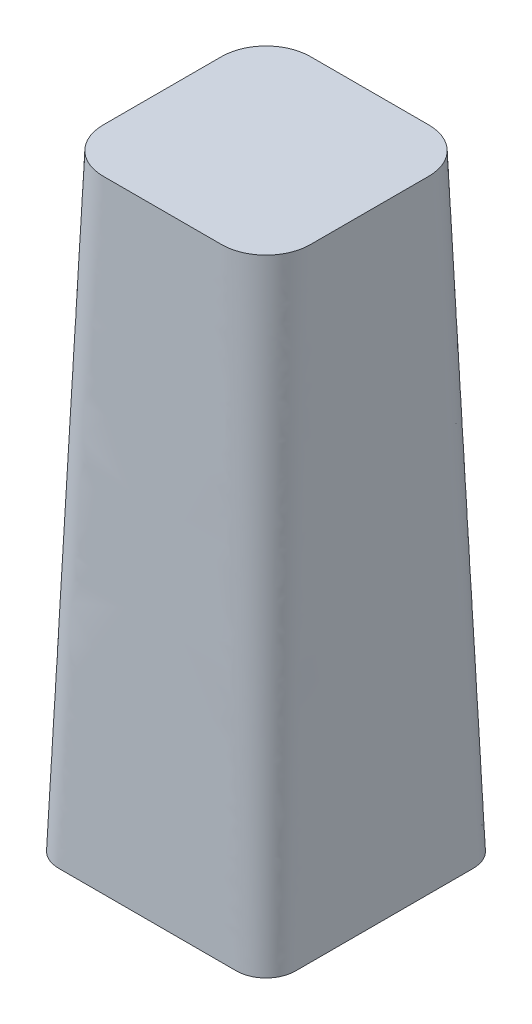
ISO-10303-21;
HEADER;
FILE_DESCRIPTION(('STEP AP214'),'2;1');
FILE_NAME('part.step','',(''),(''),'','','');
FILE_SCHEMA(('AUTOMOTIVE_DESIGN { 1 0 10303 214 1 1 1 1 }'));
ENDSEC;
DATA;
#1=APPLICATION_CONTEXT('core data for automotive mechanical design processes');
#2=APPLICATION_PROTOCOL_DEFINITION('international standard','automotive_design',2000,#1);
#3=PRODUCT_CONTEXT('',#1,'mechanical');
#4=PRODUCT('Part','Part','',(#3));
#5=PRODUCT_RELATED_PRODUCT_CATEGORY('part','',(#4));
#6=PRODUCT_DEFINITION_FORMATION('','',#4);
#7=PRODUCT_DEFINITION_CONTEXT('part definition',#1,'design');
#8=PRODUCT_DEFINITION('design','',#6,#7);
#9=PRODUCT_DEFINITION_SHAPE('','',#8);
#10=(LENGTH_UNIT() NAMED_UNIT(*) SI_UNIT(.MILLI.,.METRE.));
#11=(NAMED_UNIT(*) PLANE_ANGLE_UNIT() SI_UNIT($,.RADIAN.));
#12=(NAMED_UNIT(*) SI_UNIT($,.STERADIAN.) SOLID_ANGLE_UNIT());
#13=UNCERTAINTY_MEASURE_WITH_UNIT(LENGTH_MEASURE(1.E-05),#10,'distance_accuracy_value','');
#14=(GEOMETRIC_REPRESENTATION_CONTEXT(3) GLOBAL_UNCERTAINTY_ASSIGNED_CONTEXT((#13)) GLOBAL_UNIT_ASSIGNED_CONTEXT((#10,
#11,#12)) REPRESENTATION_CONTEXT('',''));
#15=CARTESIAN_POINT('',(0.,0.,0.));
#16=DIRECTION('',(0.,0.,1.));
#17=DIRECTION('',(1.,0.,0.));
#18=AXIS2_PLACEMENT_3D('',#15,#16,#17);
#19=CARTESIAN_POINT('',(-4.,41.,4.));
#20=DIRECTION('',(0.,1.,0.));
#21=DIRECTION('',(0.,0.,1.));
#22=AXIS2_PLACEMENT_3D('',#19,#20,#21);
#23=PLANE('',#22);
#24=CARTESIAN_POINT('',(-4.,41.,4.));
#25=DIRECTION('',(0.,1.,0.));
#26=DIRECTION('',(0.,0.,1.));
#27=AXIS2_PLACEMENT_3D('',#24,#25,#26);
#28=CIRCLE('',#27,3.);
#29=CARTESIAN_POINT('',(-7.,41.,3.99999999999998));
#30=VERTEX_POINT('',#29);
#31=CARTESIAN_POINT('',(-3.99999999991578,41.,7.));
#32=VERTEX_POINT('',#31);
#33=EDGE_CURVE('E422',#30,#32,#28,.T.);
#34=ORIENTED_EDGE('',*,*,#33,.T.);
#35=DIRECTION('',(1.,0.,0.));
#36=VECTOR('',#35,1.);
#37=CARTESIAN_POINT('',(-3.99999999999998,41.,7.));
#38=LINE('',#37,#36);
#39=CARTESIAN_POINT('',(3.99999999985876,41.,7.));
#40=VERTEX_POINT('',#39);
#41=EDGE_CURVE('E537',#32,#40,#38,.T.);
#42=ORIENTED_EDGE('',*,*,#41,.T.);
#43=CARTESIAN_POINT('',(4.,41.,4.));
#44=DIRECTION('',(0.,1.,0.));
#45=DIRECTION('',(0.,0.,1.));
#46=AXIS2_PLACEMENT_3D('',#43,#44,#45);
#47=CIRCLE('',#46,3.);
#48=CARTESIAN_POINT('',(7.,41.,3.99999999991575));
#49=VERTEX_POINT('',#48);
#50=EDGE_CURVE('E529',#40,#49,#47,.T.);
#51=ORIENTED_EDGE('',*,*,#50,.T.);
#52=DIRECTION('',(0.,0.,1.));
#53=VECTOR('',#52,1.);
#54=CARTESIAN_POINT('',(7.,41.,-3.99999999999998));
#55=LINE('',#54,#53);
#56=CARTESIAN_POINT('',(7.,41.,-3.99999999985876));
#57=VERTEX_POINT('',#56);
#58=EDGE_CURVE('E523',#57,#49,#55,.T.);
#59=ORIENTED_EDGE('',*,*,#58,.F.);
#60=CARTESIAN_POINT('',(4.,41.,-4.));
#61=DIRECTION('',(0.,1.,0.));
#62=DIRECTION('',(0.,0.,1.));
#63=AXIS2_PLACEMENT_3D('',#60,#61,#62);
#64=CIRCLE('',#63,3.);
#65=CARTESIAN_POINT('',(3.99999999991556,41.,-7.));
#66=VERTEX_POINT('',#65);
#67=EDGE_CURVE('E515',#57,#66,#64,.T.);
#68=ORIENTED_EDGE('',*,*,#67,.T.);
#69=DIRECTION('',(1.,0.,0.));
#70=VECTOR('',#69,1.);
#71=CARTESIAN_POINT('',(-3.99999999999998,41.,-7.));
#72=LINE('',#71,#70);
#73=CARTESIAN_POINT('',(-3.99999999985876,41.,-7.));
#74=VERTEX_POINT('',#73);
#75=EDGE_CURVE('E507',#74,#66,#72,.T.);
#76=ORIENTED_EDGE('',*,*,#75,.F.);
#77=CARTESIAN_POINT('',(-4.,41.,-4.));
#78=DIRECTION('',(0.,1.,0.));
#79=DIRECTION('',(0.,0.,1.));
#80=AXIS2_PLACEMENT_3D('',#77,#78,#79);
#81=CIRCLE('',#80,3.);
#82=CARTESIAN_POINT('',(-7.,41.,-3.99999999999998));
#83=VERTEX_POINT('',#82);
#84=EDGE_CURVE('E243',#74,#83,#81,.T.);
#85=ORIENTED_EDGE('',*,*,#84,.T.);
#86=DIRECTION('',(0.,0.,1.));
#87=VECTOR('',#86,1.);
#88=CARTESIAN_POINT('',(-7.,41.,-3.99999999999998));
#89=LINE('',#88,#87);
#90=EDGE_CURVE('E12',#83,#30,#89,.T.);
#91=ORIENTED_EDGE('',*,*,#90,.T.);
#92=EDGE_LOOP('',(#34,#42,#51,#59,#68,#76,#85,#91));
#93=FACE_BOUND('',#92,.T.);
#94=ADVANCED_FACE('F231',(#93),#23,.T.);
#95=CARTESIAN_POINT('',(-6.,0.,6.));
#96=DIRECTION('',(0.,1.,0.));
#97=DIRECTION('',(0.,0.,1.));
#98=AXIS2_PLACEMENT_3D('',#95,#96,#97);
#99=PLANE('',#98);
#100=CARTESIAN_POINT('',(-6.,0.,6.));
#101=DIRECTION('',(0.,1.,0.));
#102=DIRECTION('',(0.,0.,1.));
#103=AXIS2_PLACEMENT_3D('',#100,#101,#102);
#104=CIRCLE('',#103,2.);
#105=CARTESIAN_POINT('',(-8.,0.,5.99999999999999));
#106=VERTEX_POINT('',#105);
#107=CARTESIAN_POINT('',(-5.99999999999999,0.,8.));
#108=VERTEX_POINT('',#107);
#109=EDGE_CURVE('E303',#106,#108,#104,.T.);
#110=ORIENTED_EDGE('',*,*,#109,.F.);
#111=DIRECTION('',(0.,0.,1.));
#112=VECTOR('',#111,1.);
#113=CARTESIAN_POINT('',(-8.,0.,-5.99999999999999));
#114=LINE('',#113,#112);
#115=CARTESIAN_POINT('',(-8.,0.,-5.99999999999999));
#116=VERTEX_POINT('',#115);
#117=EDGE_CURVE('E312',#116,#106,#114,.T.);
#118=ORIENTED_EDGE('',*,*,#117,.F.);
#119=CARTESIAN_POINT('',(-6.,0.,-6.));
#120=DIRECTION('',(0.,1.,0.));
#121=DIRECTION('',(0.,0.,1.));
#122=AXIS2_PLACEMENT_3D('',#119,#120,#121);
#123=CIRCLE('',#122,2.);
#124=CARTESIAN_POINT('',(-5.99999999999999,0.,-8.));
#125=VERTEX_POINT('',#124);
#126=EDGE_CURVE('E427',#125,#116,#123,.T.);
#127=ORIENTED_EDGE('',*,*,#126,.F.);
#128=DIRECTION('',(1.,0.,0.));
#129=VECTOR('',#128,1.);
#130=CARTESIAN_POINT('',(-5.99999999999999,0.,-8.));
#131=LINE('',#130,#129);
#132=CARTESIAN_POINT('',(5.99999999999999,0.,-8.));
#133=VERTEX_POINT('',#132);
#134=EDGE_CURVE('E441',#125,#133,#131,.T.);
#135=ORIENTED_EDGE('',*,*,#134,.T.);
#136=CARTESIAN_POINT('',(6.,0.,-6.));
#137=DIRECTION('',(0.,1.,0.));
#138=DIRECTION('',(0.,0.,1.));
#139=AXIS2_PLACEMENT_3D('',#136,#137,#138);
#140=CIRCLE('',#139,2.);
#141=CARTESIAN_POINT('',(8.,0.,-5.99999999999999));
#142=VERTEX_POINT('',#141);
#143=EDGE_CURVE('E446',#142,#133,#140,.T.);
#144=ORIENTED_EDGE('',*,*,#143,.F.);
#145=DIRECTION('',(0.,0.,1.));
#146=VECTOR('',#145,1.);
#147=CARTESIAN_POINT('',(8.,0.,-5.99999999999999));
#148=LINE('',#147,#146);
#149=CARTESIAN_POINT('',(8.,0.,5.99999999999999));
#150=VERTEX_POINT('',#149);
#151=EDGE_CURVE('E461',#142,#150,#148,.T.);
#152=ORIENTED_EDGE('',*,*,#151,.T.);
#153=CARTESIAN_POINT('',(6.,0.,6.));
#154=DIRECTION('',(0.,1.,0.));
#155=DIRECTION('',(0.,0.,1.));
#156=AXIS2_PLACEMENT_3D('',#153,#154,#155);
#157=CIRCLE('',#156,2.);
#158=CARTESIAN_POINT('',(5.99999999999999,0.,8.));
#159=VERTEX_POINT('',#158);
#160=EDGE_CURVE('E305',#159,#150,#157,.T.);
#161=ORIENTED_EDGE('',*,*,#160,.F.);
#162=DIRECTION('',(1.,0.,0.));
#163=VECTOR('',#162,1.);
#164=CARTESIAN_POINT('',(-5.99999999999999,0.,8.));
#165=LINE('',#164,#163);
#166=EDGE_CURVE('E300',#108,#159,#165,.T.);
#167=ORIENTED_EDGE('',*,*,#166,.F.);
#168=EDGE_LOOP('',(#110,#118,#127,#135,#144,#152,#161,#167));
#169=FACE_BOUND('',#168,.T.);
#170=ADVANCED_FACE('F297',(#169),#99,.F.);
#171=CARTESIAN_POINT('',(-5.99999999901381,0.,8.));
#172=CARTESIAN_POINT('',(-3.99999999917202,41.,7.));
#173=CARTESIAN_POINT('',(-5.1029701766533,0.,8.));
#174=CARTESIAN_POINT('',(-3.24688292029269,41.,7.));
#175=CARTESIAN_POINT('',(-3.18082361984502,0.,8.));
#176=CARTESIAN_POINT('',(-1.89225139112458,41.,7.));
#177=CARTESIAN_POINT('',(0.,0.,8.));
#178=CARTESIAN_POINT('',(0.,41.0000000000001,7.));
#179=CARTESIAN_POINT('',(3.18082361984502,0.,8.));
#180=CARTESIAN_POINT('',(1.89225139112458,41.,7.));
#181=CARTESIAN_POINT('',(5.1029701766533,0.,8.));
#182=CARTESIAN_POINT('',(3.24688292029269,41.,7.));
#183=CARTESIAN_POINT('',(6.18238478103951,0.,8.));
#184=CARTESIAN_POINT('',(4.15312433333271,41.,7.));
#185=CARTESIAN_POINT('',(6.48066479771047,0.,7.95499481573023));
#186=CARTESIAN_POINT('',(4.47935929820771,41.,6.97678912731978));
#187=CARTESIAN_POINT('',(6.848061214367,0.,7.82423870663479));
#188=CARTESIAN_POINT('',(5.02404497942994,41.,6.84082888647453));
#189=CARTESIAN_POINT('',(7.15680336671806,0.,7.64351907434468));
#190=CARTESIAN_POINT('',(5.59850216324002,41.,6.56785496894204));
#191=CARTESIAN_POINT('',(7.4213028488176,0.,7.42130284881762));
#192=CARTESIAN_POINT('',(6.1405144045584,41.,6.14051440455839));
#193=CARTESIAN_POINT('',(7.64351907434469,0.,7.15680336671805));
#194=CARTESIAN_POINT('',(6.56785496894205,41.,5.59850216324003));
#195=CARTESIAN_POINT('',(7.82423870663478,0.,6.84806121436701));
#196=CARTESIAN_POINT('',(6.84082888647453,41.,5.02404497942993));
#197=CARTESIAN_POINT('',(7.95499481573024,0.,6.48066479771046));
#198=CARTESIAN_POINT('',(6.97678912731978,41.,4.47935929820772));
#199=CARTESIAN_POINT('',(8.,0.,6.18238478103951));
#200=CARTESIAN_POINT('',(7.,41.,4.15312433333271));
#201=CARTESIAN_POINT('',(8.,0.,5.10297017665329));
#202=CARTESIAN_POINT('',(7.,41.,3.24688292029269));
#203=CARTESIAN_POINT('',(8.,0.,3.18082361984502));
#204=CARTESIAN_POINT('',(7.,41.,1.89225139112457));
#205=CARTESIAN_POINT('',(8.,0.,0.));
#206=CARTESIAN_POINT('',(7.,41.,0.));
#207=CARTESIAN_POINT('',(8.,0.,-3.18082361984502));
#208=CARTESIAN_POINT('',(7.,41.,-1.89225139112457));
#209=CARTESIAN_POINT('',(8.,0.,-5.1029701766533));
#210=CARTESIAN_POINT('',(7.,41.,-3.24688292029269));
#211=CARTESIAN_POINT('',(8.,0.,-6.18238478103951));
#212=CARTESIAN_POINT('',(7.,41.,-4.15312433333271));
#213=CARTESIAN_POINT('',(7.95499481573023,0.,-6.48066479771047));
#214=CARTESIAN_POINT('',(6.97678912731977,41.0000000000001,-4.47935929820771));
#215=CARTESIAN_POINT('',(7.82423870663479,0.,-6.848061214367));
#216=CARTESIAN_POINT('',(6.84082888647454,41.,-5.02404497942994));
#217=CARTESIAN_POINT('',(7.64351907434468,0.,-7.15680336671804));
#218=CARTESIAN_POINT('',(6.56785496894203,41.,-5.59850216324001));
#219=CARTESIAN_POINT('',(7.42130284881762,0.,-7.42130284881762));
#220=CARTESIAN_POINT('',(6.14051440455841,41.,-6.14051440455841));
#221=CARTESIAN_POINT('',(7.15680336671805,0.,-7.64351907434466));
#222=CARTESIAN_POINT('',(5.59850216324001,41.,-6.56785496894203));
#223=CARTESIAN_POINT('',(6.84806121436701,0.,-7.8242387066348));
#224=CARTESIAN_POINT('',(5.02404497942994,41.,-6.84082888647453));
#225=CARTESIAN_POINT('',(6.48066479771046,0.,-7.95499481573022));
#226=CARTESIAN_POINT('',(4.47935929820771,41.,-6.97678912731977));
#227=CARTESIAN_POINT('',(6.18238478103951,0.,-8.));
#228=CARTESIAN_POINT('',(4.15312433333271,41.,-7.));
#229=CARTESIAN_POINT('',(5.10297017665329,0.,-8.));
#230=CARTESIAN_POINT('',(3.24688292029269,41.,-7.));
#231=CARTESIAN_POINT('',(3.18082361984502,0.,-8.00000000000001));
#232=CARTESIAN_POINT('',(1.89225139112458,41.,-7.00000000000001));
#233=CARTESIAN_POINT('',(0.,0.,-7.99999999999999));
#234=CARTESIAN_POINT('',(0.,41.,-6.99999999999999));
#235=CARTESIAN_POINT('',(-3.18082361984502,0.,-8.00000000000001));
#236=CARTESIAN_POINT('',(-1.89225139112458,41.,-7.));
#237=CARTESIAN_POINT('',(-5.10297017665329,0.,-8.));
#238=CARTESIAN_POINT('',(-3.24688292029269,41.,-7.));
#239=CARTESIAN_POINT('',(-6.18238478103951,0.,-8.));
#240=CARTESIAN_POINT('',(-4.15312433333271,41.,-7.));
#241=CARTESIAN_POINT('',(-6.48066479771048,0.,-7.95499481573022));
#242=CARTESIAN_POINT('',(-4.47935929820772,41.,-6.97678912731977));
#243=CARTESIAN_POINT('',(-6.84806121436698,0.,-7.82423870663481));
#244=CARTESIAN_POINT('',(-5.02404497942994,41.,-6.84082888647454));
#245=CARTESIAN_POINT('',(-7.15680336671806,0.,-7.64351907434467));
#246=CARTESIAN_POINT('',(-5.59850216324002,41.,-6.56785496894203));
#247=CARTESIAN_POINT('',(-7.4213028488176,0.,-7.42130284881762));
#248=CARTESIAN_POINT('',(-6.14051440455841,41.,-6.14051440455841));
#249=CARTESIAN_POINT('',(-7.64351907434469,0.,-7.15680336671804));
#250=CARTESIAN_POINT('',(-6.56785496894204,41.,-5.59850216324001));
#251=CARTESIAN_POINT('',(-7.82423870663478,0.,-6.84806121436701));
#252=CARTESIAN_POINT('',(-6.84082888647454,41.,-5.02404497942993));
#253=CARTESIAN_POINT('',(-7.95499481573024,0.,-6.48066479771046));
#254=CARTESIAN_POINT('',(-6.97678912731977,41.,-4.47935929820771));
#255=CARTESIAN_POINT('',(-8.,0.,-6.18238478103951));
#256=CARTESIAN_POINT('',(-7.,41.,-4.15312433333271));
#257=CARTESIAN_POINT('',(-8.,0.,-5.1029701766533));
#258=CARTESIAN_POINT('',(-7.,41.,-3.24688292029269));
#259=CARTESIAN_POINT('',(-8.,0.,-3.18082361984502));
#260=CARTESIAN_POINT('',(-7.,41.,-1.89225139112458));
#261=CARTESIAN_POINT('',(-7.99999999999999,0.,0.));
#262=CARTESIAN_POINT('',(-7.,41.,0.));
#263=CARTESIAN_POINT('',(-8.00000000000001,0.,3.18082361984501));
#264=CARTESIAN_POINT('',(-7.00000000000001,41.,1.89225139112457));
#265=CARTESIAN_POINT('',(-8.,0.,5.10297017665329));
#266=CARTESIAN_POINT('',(-7.,41.,3.24688292029269));
#267=CARTESIAN_POINT('',(-8.,0.,6.18238478103951));
#268=CARTESIAN_POINT('',(-7.,41.,4.15312433333271));
#269=CARTESIAN_POINT('',(-7.95499481573023,0.,6.48066479771046));
#270=CARTESIAN_POINT('',(-6.97678912731976,41.,4.47935929820771));
#271=CARTESIAN_POINT('',(-7.82423870663479,0.,6.848061214367));
#272=CARTESIAN_POINT('',(-6.84082888647455,41.,5.02404497942994));
#273=CARTESIAN_POINT('',(-7.64351907434469,0.,7.15680336671806));
#274=CARTESIAN_POINT('',(-6.56785496894203,41.0000000000001,5.59850216324001));
#275=CARTESIAN_POINT('',(-7.4213028488176,0.,7.42130284881759));
#276=CARTESIAN_POINT('',(-6.14051440455841,40.9999999999999,6.14051440455838));
#277=CARTESIAN_POINT('',(-7.15680336671807,0.,7.64351907434469));
#278=CARTESIAN_POINT('',(-5.59850216324002,41.0000000000001,6.56785496894204));
#279=CARTESIAN_POINT('',(-6.848061214367,0.,7.82423870663478));
#280=CARTESIAN_POINT('',(-5.02404497942996,41.,6.84082888647452));
#281=CARTESIAN_POINT('',(-6.48066479771048,0.,7.95499481573023));
#282=CARTESIAN_POINT('',(-4.47935929820773,41.,6.97678912731978));
#283=CARTESIAN_POINT('',(-6.18238478103952,0.,8.));
#284=CARTESIAN_POINT('',(-4.15312433333273,41.,7.));
#285=CARTESIAN_POINT('',(-5.99999999901381,0.,8.));
#286=CARTESIAN_POINT('',(-3.99999999917202,41.,7.));
#287=B_SPLINE_SURFACE_WITH_KNOTS('',3,1,((#171,#172),(#173,#174),(#175,#176),(#177,#178),(#179,
#180),(#181,#182),(#183,#184),(#185,#186),(#187,#188),(#189,#190),(#191,#192),(#193,#194),(#195,
#196),(#197,#198),(#199,#200),(#201,#202),(#203,#204),(#205,#206),(#207,#208),(#209,#210),(#211,
#212),(#213,#214),(#215,#216),(#217,#218),(#219,#220),(#221,#222),(#223,#224),(#225,#226),(#227,
#228),(#229,#230),(#231,#232),(#233,#234),(#235,#236),(#237,#238),(#239,#240),(#241,#242),(#243,
#244),(#245,#246),(#247,#248),(#249,#250),(#251,#252),(#253,#254),(#255,#256),(#257,#258),(#259,
#260),(#261,#262),(#263,#264),(#265,#266),(#267,#268),(#269,#270),(#271,#272),(#273,#274),(#275,
#276),(#277,#278),(#279,#280),(#281,#282),(#283,#284),(#285,#286)),.UNSPECIFIED.,.T.,.F.,.F.,(4,
1,1,1,2,1,1,1,1,1,1,1,2,1,1,1,2,1,1,1,1,1,1,1,2,1,1,1,2,1,1,1,1,1,1,1,2,1,1,1,2,1,1,1,1,1,1,1,
4),(2,2),(0.,0.044432074148456,0.088864148296912,0.133296222445368,0.177728296593824,
0.186762259519596,0.195796222445368,0.20483018537114,0.213864148296912,0.222898111222684,
0.231932074148456,0.240966037074228,0.25,0.294432074148456,0.338864148296912,0.383296222445368,
0.427728296593824,0.436762259519596,0.445796222445368,0.45483018537114,0.463864148296912,
0.472898111222684,0.481932074148456,0.490966037074228,0.5,0.544432074148456,0.588864148296912,
0.633296222445368,0.677728296593824,0.686762259519596,0.695796222445368,0.70483018537114,
0.713864148296912,0.722898111222684,0.731932074148456,0.740966037074228,0.75,0.794432074148456,
0.838864148296912,0.883296222445368,0.927728296593824,0.936762259519596,0.945796222445368,
0.95483018537114,0.963864148296912,0.972898111222684,0.981932074148456,0.990966037074228,1.),
(0.,1.),.UNSPECIFIED.);
#288=CARTESIAN_POINT('',(-8.,0.,0.));
#289=CARTESIAN_POINT('',(-7.,41.,0.));
#290=CARTESIAN_POINT('',(-8.,0.,1.06027453994834));
#291=CARTESIAN_POINT('',(-7.,41.,0.630750463708191));
#292=CARTESIAN_POINT('',(-8.00000000000001,0.,3.18082361984501));
#293=CARTESIAN_POINT('',(-7.00000000000001,41.,1.89225139112457));
#294=CARTESIAN_POINT('',(-8.,0.,5.10297017665329));
#295=CARTESIAN_POINT('',(-7.,41.,3.24688292029269));
#296=CARTESIAN_POINT('',(-8.,0.,6.18238478103951));
#297=CARTESIAN_POINT('',(-7.,41.,4.15312433333271));
#298=CARTESIAN_POINT('',(-7.95499481573023,0.,6.48066479771046));
#299=CARTESIAN_POINT('',(-6.97678912731976,41.,4.47935929820771));
#300=CARTESIAN_POINT('',(-7.82423870663479,0.,6.848061214367));
#301=CARTESIAN_POINT('',(-6.84082888647455,41.,5.02404497942994));
#302=CARTESIAN_POINT('',(-7.64351907434469,0.,7.15680336671806));
#303=CARTESIAN_POINT('',(-6.56785496894203,41.0000000000001,5.59850216324001));
#304=CARTESIAN_POINT('',(-7.4213028488176,0.,7.42130284881759));
#305=CARTESIAN_POINT('',(-6.14051440455841,40.9999999999999,6.14051440455838));
#306=CARTESIAN_POINT('',(-7.15680336671807,0.,7.64351907434469));
#307=CARTESIAN_POINT('',(-5.59850216324002,41.0000000000001,6.56785496894204));
#308=CARTESIAN_POINT('',(-6.848061214367,0.,7.82423870663478));
#309=CARTESIAN_POINT('',(-5.02404497942996,41.,6.84082888647452));
#310=CARTESIAN_POINT('',(-6.48066479771048,0.,7.95499481573023));
#311=CARTESIAN_POINT('',(-4.47935929820773,41.,6.97678912731978));
#312=CARTESIAN_POINT('',(-6.18238478103952,0.,8.));
#313=CARTESIAN_POINT('',(-4.15312433333273,41.,7.));
#314=CARTESIAN_POINT('',(-5.1029701766533,0.,8.));
#315=CARTESIAN_POINT('',(-3.24688292029269,41.,7.));
#316=CARTESIAN_POINT('',(-3.18082361984502,0.,8.));
#317=CARTESIAN_POINT('',(-1.89225139112458,41.,7.));
#318=CARTESIAN_POINT('',(0.,0.,8.));
#319=CARTESIAN_POINT('',(0.,41.0000000000001,7.));
#320=CARTESIAN_POINT('',(3.18082361984502,0.,8.));
#321=CARTESIAN_POINT('',(1.89225139112458,41.,7.));
#322=CARTESIAN_POINT('',(5.1029701766533,0.,8.));
#323=CARTESIAN_POINT('',(3.24688292029269,41.,7.));
#324=CARTESIAN_POINT('',(6.18238478103951,0.,8.));
#325=CARTESIAN_POINT('',(4.15312433333271,41.,7.));
#326=CARTESIAN_POINT('',(6.48066479771047,0.,7.95499481573023));
#327=CARTESIAN_POINT('',(4.47935929820771,41.,6.97678912731978));
#328=CARTESIAN_POINT('',(6.848061214367,0.,7.82423870663479));
#329=CARTESIAN_POINT('',(5.02404497942994,41.,6.84082888647453));
#330=CARTESIAN_POINT('',(7.15680336671806,0.,7.64351907434468));
#331=CARTESIAN_POINT('',(5.59850216324002,41.,6.56785496894204));
#332=CARTESIAN_POINT('',(7.4213028488176,0.,7.42130284881762));
#333=CARTESIAN_POINT('',(6.1405144045584,41.,6.14051440455839));
#334=CARTESIAN_POINT('',(7.64351907434469,0.,7.15680336671805));
#335=CARTESIAN_POINT('',(6.56785496894205,41.,5.59850216324003));
#336=CARTESIAN_POINT('',(7.82423870663478,0.,6.84806121436701));
#337=CARTESIAN_POINT('',(6.84082888647453,41.,5.02404497942993));
#338=CARTESIAN_POINT('',(7.95499481573024,0.,6.48066479771046));
#339=CARTESIAN_POINT('',(6.97678912731978,41.,4.47935929820772));
#340=CARTESIAN_POINT('',(8.,0.,6.18238478103951));
#341=CARTESIAN_POINT('',(7.,41.,4.15312433333271));
#342=CARTESIAN_POINT('',(8.,0.,5.10297017665329));
#343=CARTESIAN_POINT('',(7.,41.,3.24688292029269));
#344=CARTESIAN_POINT('',(8.,0.,3.18082361984502));
#345=CARTESIAN_POINT('',(7.,41.,1.89225139112457));
#346=CARTESIAN_POINT('',(8.,0.,0.));
#347=CARTESIAN_POINT('',(7.,41.,0.));
#348=CARTESIAN_POINT('',(8.,0.,-3.18082361984502));
#349=CARTESIAN_POINT('',(7.,41.,-1.89225139112457));
#350=CARTESIAN_POINT('',(8.,0.,-5.1029701766533));
#351=CARTESIAN_POINT('',(7.,41.,-3.24688292029269));
#352=CARTESIAN_POINT('',(8.,0.,-6.18238478103951));
#353=CARTESIAN_POINT('',(7.,41.,-4.15312433333271));
#354=CARTESIAN_POINT('',(7.95499481573023,0.,-6.48066479771047));
#355=CARTESIAN_POINT('',(6.97678912731977,41.0000000000001,-4.47935929820771));
#356=CARTESIAN_POINT('',(7.82423870663479,0.,-6.848061214367));
#357=CARTESIAN_POINT('',(6.84082888647454,41.,-5.02404497942994));
#358=CARTESIAN_POINT('',(7.64351907434468,0.,-7.15680336671804));
#359=CARTESIAN_POINT('',(6.56785496894203,41.,-5.59850216324001));
#360=CARTESIAN_POINT('',(7.42130284881762,0.,-7.42130284881762));
#361=CARTESIAN_POINT('',(6.14051440455841,41.,-6.14051440455841));
#362=CARTESIAN_POINT('',(7.15680336671805,0.,-7.64351907434466));
#363=CARTESIAN_POINT('',(5.59850216324001,41.,-6.56785496894203));
#364=CARTESIAN_POINT('',(6.84806121436701,0.,-7.8242387066348));
#365=CARTESIAN_POINT('',(5.02404497942994,41.,-6.84082888647453));
#366=CARTESIAN_POINT('',(6.48066479771046,0.,-7.95499481573022));
#367=CARTESIAN_POINT('',(4.47935929820771,41.,-6.97678912731977));
#368=CARTESIAN_POINT('',(6.18238478103951,0.,-8.));
#369=CARTESIAN_POINT('',(4.15312433333271,41.,-7.));
#370=CARTESIAN_POINT('',(5.10297017665329,0.,-8.));
#371=CARTESIAN_POINT('',(3.24688292029269,41.,-7.));
#372=CARTESIAN_POINT('',(3.18082361984502,0.,-8.00000000000001));
#373=CARTESIAN_POINT('',(1.89225139112458,41.,-7.00000000000001));
#374=CARTESIAN_POINT('',(0.,0.,-7.99999999999999));
#375=CARTESIAN_POINT('',(0.,41.,-6.99999999999999));
#376=CARTESIAN_POINT('',(-3.18082361984502,0.,-8.00000000000001));
#377=CARTESIAN_POINT('',(-1.89225139112458,41.,-7.));
#378=CARTESIAN_POINT('',(-5.10297017665329,0.,-8.));
#379=CARTESIAN_POINT('',(-3.24688292029269,41.,-7.));
#380=CARTESIAN_POINT('',(-6.18238478103951,0.,-8.));
#381=CARTESIAN_POINT('',(-4.15312433333271,41.,-7.));
#382=CARTESIAN_POINT('',(-6.48066479771048,0.,-7.95499481573022));
#383=CARTESIAN_POINT('',(-4.47935929820772,41.,-6.97678912731977));
#384=CARTESIAN_POINT('',(-6.84806121436698,0.,-7.82423870663481));
#385=CARTESIAN_POINT('',(-5.02404497942994,41.,-6.84082888647454));
#386=CARTESIAN_POINT('',(-7.15680336671806,0.,-7.64351907434467));
#387=CARTESIAN_POINT('',(-5.59850216324002,41.,-6.56785496894203));
#388=CARTESIAN_POINT('',(-7.4213028488176,0.,-7.42130284881762));
#389=CARTESIAN_POINT('',(-6.14051440455841,41.,-6.14051440455841));
#390=CARTESIAN_POINT('',(-7.64351907434469,0.,-7.15680336671804));
#391=CARTESIAN_POINT('',(-6.56785496894204,41.,-5.59850216324001));
#392=CARTESIAN_POINT('',(-7.82423870663478,0.,-6.84806121436701));
#393=CARTESIAN_POINT('',(-6.84082888647454,41.,-5.02404497942993));
#394=CARTESIAN_POINT('',(-7.95499481573024,0.,-6.48066479771046));
#395=CARTESIAN_POINT('',(-6.97678912731977,41.,-4.47935929820771));
#396=CARTESIAN_POINT('',(-8.,0.,-6.18238478103951));
#397=CARTESIAN_POINT('',(-7.,41.,-4.15312433333271));
#398=CARTESIAN_POINT('',(-8.,0.,-5.1029701766533));
#399=CARTESIAN_POINT('',(-7.,41.,-3.24688292029269));
#400=CARTESIAN_POINT('',(-8.,0.,-3.18082361984502));
#401=CARTESIAN_POINT('',(-7.,41.,-1.89225139112458));
#402=CARTESIAN_POINT('',(-8.,0.,-1.06027453994834));
#403=CARTESIAN_POINT('',(-7.,41.,-0.630750463708192));
#404=CARTESIAN_POINT('',(-8.,0.,0.));
#405=CARTESIAN_POINT('',(-7.,41.,0.));
#406=B_SPLINE_SURFACE_WITH_KNOTS('',3,1,((#288,#289),(#290,#291),(#292,#293),(#294,#295),(#296,
#297),(#298,#299),(#300,#301),(#302,#303),(#304,#305),(#306,#307),(#308,#309),(#310,#311),(#312,
#313),(#314,#315),(#316,#317),(#318,#319),(#320,#321),(#322,#323),(#324,#325),(#326,#327),(#328,
#329),(#330,#331),(#332,#333),(#334,#335),(#336,#337),(#338,#339),(#340,#341),(#342,#343),(#344,
#345),(#346,#347),(#348,#349),(#350,#351),(#352,#353),(#354,#355),(#356,#357),(#358,#359),(#360,
#361),(#362,#363),(#364,#365),(#366,#367),(#368,#369),(#370,#371),(#372,#373),(#374,#375),(#376,
#377),(#378,#379),(#380,#381),(#382,#383),(#384,#385),(#386,#387),(#388,#389),(#390,#391),(#392,
#393),(#394,#395),(#396,#397),(#398,#399),(#400,#401),(#402,#403),(#404,#405)),.UNSPECIFIED.,
.T.,.F.,.F.,(4,1,2,1,1,1,1,1,1,1,2,1,1,1,2,1,1,1,1,1,1,1,2,1,1,1,2,1,1,1,1,1,1,1,2,1,1,1,2,1,1,
1,1,1,1,1,2,1,4),(2,2),(0.838864148296912,0.883296222445368,0.927728296593824,0.936762259519596,
0.945796222445368,0.95483018537114,0.963864148296912,0.972898111222684,0.981932074148456,
0.990966037074228,1.,1.04443207414846,1.08886414829691,1.13329622244537,1.17772829659382,
1.1867622595196,1.19579622244537,1.20483018537114,1.21386414829691,1.22289811122268,
1.23193207414846,1.24096603707423,1.25,1.29443207414846,1.33886414829691,1.38329622244537,
1.42772829659382,1.4367622595196,1.44579622244537,1.45483018537114,1.46386414829691,
1.47289811122268,1.48193207414846,1.49096603707423,1.5,1.54443207414846,1.58886414829691,
1.63329622244537,1.67772829659382,1.6867622595196,1.69579622244537,1.70483018537114,
1.71386414829691,1.72289811122268,1.73193207414846,1.74096603707423,1.75,1.79443207414846,
1.83886414829691),(0.,1.),.UNSPECIFIED.);
#407=ORIENTED_EDGE('',*,*,#117,.T.);
#408=ORIENTED_EDGE('',*,*,#109,.T.);
#409=ORIENTED_EDGE('',*,*,#166,.T.);
#410=ORIENTED_EDGE('',*,*,#160,.T.);
#411=ORIENTED_EDGE('',*,*,#151,.F.);
#412=ORIENTED_EDGE('',*,*,#143,.T.);
#413=ORIENTED_EDGE('',*,*,#134,.F.);
#414=ORIENTED_EDGE('',*,*,#126,.T.);
#415=EDGE_LOOP('',(#407,#408,#409,#410,#411,#412,#413,#414));
#416=FACE_BOUND('',#415,.T.);
#417=ORIENTED_EDGE('',*,*,#84,.F.);
#418=ORIENTED_EDGE('',*,*,#75,.T.);
#419=ORIENTED_EDGE('',*,*,#67,.F.);
#420=ORIENTED_EDGE('',*,*,#58,.T.);
#421=ORIENTED_EDGE('',*,*,#50,.F.);
#422=ORIENTED_EDGE('',*,*,#41,.F.);
#423=ORIENTED_EDGE('',*,*,#33,.F.);
#424=ORIENTED_EDGE('',*,*,#90,.F.);
#425=EDGE_LOOP('',(#417,#418,#419,#420,#421,#422,#423,#424));
#426=FACE_BOUND('',#425,.T.);
#427=ADVANCED_FACE('F315',(#416,#426),#406,.T.);
#428=CLOSED_SHELL('',(#94,#170,#427));
#429=MANIFOLD_SOLID_BREP('B2',#428);
#430=ADVANCED_BREP_SHAPE_REPRESENTATION('',(#18,#429),#14);
#431=SHAPE_DEFINITION_REPRESENTATION(#9,#430);
ENDSEC;
END-ISO-10303-21;
